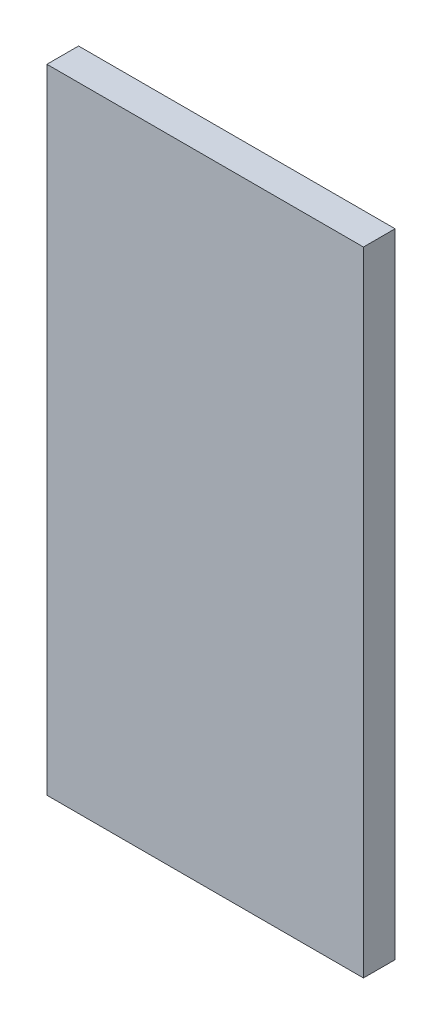
ISO-10303-21;
HEADER;
FILE_DESCRIPTION(('STEP AP214'),'2;1');
FILE_NAME('part.step','',(''),(''),'','','');
FILE_SCHEMA(('AUTOMOTIVE_DESIGN { 1 0 10303 214 1 1 1 1 }'));
ENDSEC;
DATA;
#1=APPLICATION_CONTEXT('core data for automotive mechanical design processes');
#2=APPLICATION_PROTOCOL_DEFINITION('international standard','automotive_design',2000,#1);
#3=PRODUCT_CONTEXT('',#1,'mechanical');
#4=PRODUCT('Part','Part','',(#3));
#5=PRODUCT_RELATED_PRODUCT_CATEGORY('part','',(#4));
#6=PRODUCT_DEFINITION_FORMATION('','',#4);
#7=PRODUCT_DEFINITION_CONTEXT('part definition',#1,'design');
#8=PRODUCT_DEFINITION('design','',#6,#7);
#9=PRODUCT_DEFINITION_SHAPE('','',#8);
#10=(LENGTH_UNIT() NAMED_UNIT(*) SI_UNIT(.MILLI.,.METRE.));
#11=(NAMED_UNIT(*) PLANE_ANGLE_UNIT() SI_UNIT($,.RADIAN.));
#12=(NAMED_UNIT(*) SI_UNIT($,.STERADIAN.) SOLID_ANGLE_UNIT());
#13=UNCERTAINTY_MEASURE_WITH_UNIT(LENGTH_MEASURE(1.E-05),#10,'distance_accuracy_value','');
#14=(GEOMETRIC_REPRESENTATION_CONTEXT(3) GLOBAL_UNCERTAINTY_ASSIGNED_CONTEXT((#13)) GLOBAL_UNIT_ASSIGNED_CONTEXT((#10,
#11,#12)) REPRESENTATION_CONTEXT('',''));
#15=CARTESIAN_POINT('',(0.,0.,0.));
#16=DIRECTION('',(0.,0.,1.));
#17=DIRECTION('',(1.,0.,0.));
#18=AXIS2_PLACEMENT_3D('',#15,#16,#17);
#19=CARTESIAN_POINT('',(-53.9670359283947,958.613599738783,50.));
#20=DIRECTION('',(0.,1.,0.));
#21=DIRECTION('',(0.,0.,1.));
#22=AXIS2_PLACEMENT_3D('',#19,#20,#21);
#23=PLANE('',#22);
#24=DIRECTION('',(1.,0.,0.));
#25=VECTOR('',#24,1.);
#26=CARTESIAN_POINT('',(-53.9670359283947,958.613599738783,0.));
#27=LINE('',#26,#25);
#28=CARTESIAN_POINT('',(-53.9670359283947,958.613599738783,0.));
#29=VERTEX_POINT('',#28);
#30=CARTESIAN_POINT('',(446.032964071605,958.613599738783,0.));
#31=VERTEX_POINT('',#30);
#32=EDGE_CURVE('E110',#29,#31,#27,.T.);
#33=ORIENTED_EDGE('',*,*,#32,.F.);
#34=DIRECTION('',(0.,0.,-1.));
#35=VECTOR('',#34,1.);
#36=CARTESIAN_POINT('',(-53.9670359283947,958.613599738783,50.));
#37=LINE('',#36,#35);
#38=CARTESIAN_POINT('',(-53.9670359283947,958.613599738783,50.));
#39=VERTEX_POINT('',#38);
#40=EDGE_CURVE('E11',#39,#29,#37,.T.);
#41=ORIENTED_EDGE('',*,*,#40,.F.);
#42=DIRECTION('',(1.,0.,0.));
#43=VECTOR('',#42,1.);
#44=CARTESIAN_POINT('',(-53.9670359283947,958.613599738783,50.));
#45=LINE('',#44,#43);
#46=CARTESIAN_POINT('',(446.032964071605,958.613599738783,50.));
#47=VERTEX_POINT('',#46);
#48=EDGE_CURVE('E103',#39,#47,#45,.T.);
#49=ORIENTED_EDGE('',*,*,#48,.T.);
#50=DIRECTION('',(0.,0.,-1.));
#51=VECTOR('',#50,1.);
#52=CARTESIAN_POINT('',(446.032964071605,958.613599738783,50.));
#53=LINE('',#52,#51);
#54=EDGE_CURVE('E42',#47,#31,#53,.T.);
#55=ORIENTED_EDGE('',*,*,#54,.T.);
#56=EDGE_LOOP('',(#33,#41,#49,#55));
#57=FACE_BOUND('',#56,.T.);
#58=ADVANCED_FACE('F39',(#57),#23,.T.);
#59=CARTESIAN_POINT('',(-53.9670359283947,958.613599738783,50.));
#60=DIRECTION('',(1.,0.,0.));
#61=DIRECTION('',(0.,1.,0.));
#62=AXIS2_PLACEMENT_3D('',#59,#60,#61);
#63=PLANE('',#62);
#64=DIRECTION('',(0.,-1.,0.));
#65=VECTOR('',#64,1.);
#66=CARTESIAN_POINT('',(-53.9670359283947,958.613599738783,0.));
#67=LINE('',#66,#65);
#68=CARTESIAN_POINT('',(-53.9670359283946,-41.3864002612172,0.));
#69=VERTEX_POINT('',#68);
#70=EDGE_CURVE('E73',#29,#69,#67,.T.);
#71=ORIENTED_EDGE('',*,*,#70,.T.);
#72=DIRECTION('',(0.,0.,-1.));
#73=VECTOR('',#72,1.);
#74=CARTESIAN_POINT('',(-53.9670359283946,-41.3864002612172,50.));
#75=LINE('',#74,#73);
#76=CARTESIAN_POINT('',(-53.9670359283946,-41.3864002612172,50.));
#77=VERTEX_POINT('',#76);
#78=EDGE_CURVE('E49',#77,#69,#75,.T.);
#79=ORIENTED_EDGE('',*,*,#78,.F.);
#80=DIRECTION('',(0.,-1.,0.));
#81=VECTOR('',#80,1.);
#82=CARTESIAN_POINT('',(-53.9670359283947,958.613599738783,50.));
#83=LINE('',#82,#81);
#84=EDGE_CURVE('E90',#39,#77,#83,.T.);
#85=ORIENTED_EDGE('',*,*,#84,.F.);
#86=ORIENTED_EDGE('',*,*,#40,.T.);
#87=EDGE_LOOP('',(#71,#79,#85,#86));
#88=FACE_BOUND('',#87,.T.);
#89=ADVANCED_FACE('F126',(#88),#63,.F.);
#90=CARTESIAN_POINT('',(-53.9670359283946,-41.3864002612172,50.));
#91=DIRECTION('',(0.,1.,0.));
#92=DIRECTION('',(0.,0.,1.));
#93=AXIS2_PLACEMENT_3D('',#90,#91,#92);
#94=PLANE('',#93);
#95=DIRECTION('',(1.,0.,0.));
#96=VECTOR('',#95,1.);
#97=CARTESIAN_POINT('',(-53.9670359283946,-41.3864002612172,0.));
#98=LINE('',#97,#96);
#99=CARTESIAN_POINT('',(446.032964071605,-41.3864002612172,0.));
#100=VERTEX_POINT('',#99);
#101=EDGE_CURVE('E98',#69,#100,#98,.T.);
#102=ORIENTED_EDGE('',*,*,#101,.T.);
#103=DIRECTION('',(0.,0.,-1.));
#104=VECTOR('',#103,1.);
#105=CARTESIAN_POINT('',(446.032964071605,-41.3864002612172,50.));
#106=LINE('',#105,#104);
#107=CARTESIAN_POINT('',(446.032964071605,-41.3864002612172,50.));
#108=VERTEX_POINT('',#107);
#109=EDGE_CURVE('E95',#108,#100,#106,.T.);
#110=ORIENTED_EDGE('',*,*,#109,.F.);
#111=DIRECTION('',(1.,0.,0.));
#112=VECTOR('',#111,1.);
#113=CARTESIAN_POINT('',(-53.9670359283946,-41.3864002612172,50.));
#114=LINE('',#113,#112);
#115=EDGE_CURVE('E85',#77,#108,#114,.T.);
#116=ORIENTED_EDGE('',*,*,#115,.F.);
#117=ORIENTED_EDGE('',*,*,#78,.T.);
#118=EDGE_LOOP('',(#102,#110,#116,#117));
#119=FACE_BOUND('',#118,.T.);
#120=ADVANCED_FACE('F96',(#119),#94,.F.);
#121=CARTESIAN_POINT('',(446.032964071605,958.613599738783,50.));
#122=DIRECTION('',(1.,0.,0.));
#123=DIRECTION('',(0.,1.,0.));
#124=AXIS2_PLACEMENT_3D('',#121,#122,#123);
#125=PLANE('',#124);
#126=DIRECTION('',(0.,-1.,0.));
#127=VECTOR('',#126,1.);
#128=CARTESIAN_POINT('',(446.032964071605,958.613599738783,0.));
#129=LINE('',#128,#127);
#130=EDGE_CURVE('E114',#31,#100,#129,.T.);
#131=ORIENTED_EDGE('',*,*,#130,.F.);
#132=ORIENTED_EDGE('',*,*,#54,.F.);
#133=DIRECTION('',(0.,-1.,0.));
#134=VECTOR('',#133,1.);
#135=CARTESIAN_POINT('',(446.032964071605,958.613599738783,50.));
#136=LINE('',#135,#134);
#137=EDGE_CURVE('E89',#47,#108,#136,.T.);
#138=ORIENTED_EDGE('',*,*,#137,.T.);
#139=ORIENTED_EDGE('',*,*,#109,.T.);
#140=EDGE_LOOP('',(#131,#132,#138,#139));
#141=FACE_BOUND('',#140,.T.);
#142=ADVANCED_FACE('F101',(#141),#125,.T.);
#143=CARTESIAN_POINT('',(0.,0.,50.));
#144=DIRECTION('',(0.,0.,-1.));
#145=DIRECTION('',(-1.,0.,0.));
#146=AXIS2_PLACEMENT_3D('',#143,#144,#145);
#147=PLANE('',#146);
#148=ORIENTED_EDGE('',*,*,#48,.F.);
#149=ORIENTED_EDGE('',*,*,#84,.T.);
#150=ORIENTED_EDGE('',*,*,#115,.T.);
#151=ORIENTED_EDGE('',*,*,#137,.F.);
#152=EDGE_LOOP('',(#148,#149,#150,#151));
#153=FACE_BOUND('',#152,.T.);
#154=ADVANCED_FACE('F88',(#153),#147,.F.);
#155=CARTESIAN_POINT('',(0.,0.,0.));
#156=DIRECTION('',(0.,0.,-1.));
#157=DIRECTION('',(-1.,0.,0.));
#158=AXIS2_PLACEMENT_3D('',#155,#156,#157);
#159=PLANE('',#158);
#160=ORIENTED_EDGE('',*,*,#32,.T.);
#161=ORIENTED_EDGE('',*,*,#130,.T.);
#162=ORIENTED_EDGE('',*,*,#101,.F.);
#163=ORIENTED_EDGE('',*,*,#70,.F.);
#164=EDGE_LOOP('',(#160,#161,#162,#163));
#165=FACE_BOUND('',#164,.T.);
#166=ADVANCED_FACE('F123',(#165),#159,.T.);
#167=CLOSED_SHELL('',(#58,#89,#120,#142,#154,#166));
#168=MANIFOLD_SOLID_BREP('B2',#167);
#169=ADVANCED_BREP_SHAPE_REPRESENTATION('',(#18,#168),#14);
#170=SHAPE_DEFINITION_REPRESENTATION(#9,#169);
ENDSEC;
END-ISO-10303-21;
